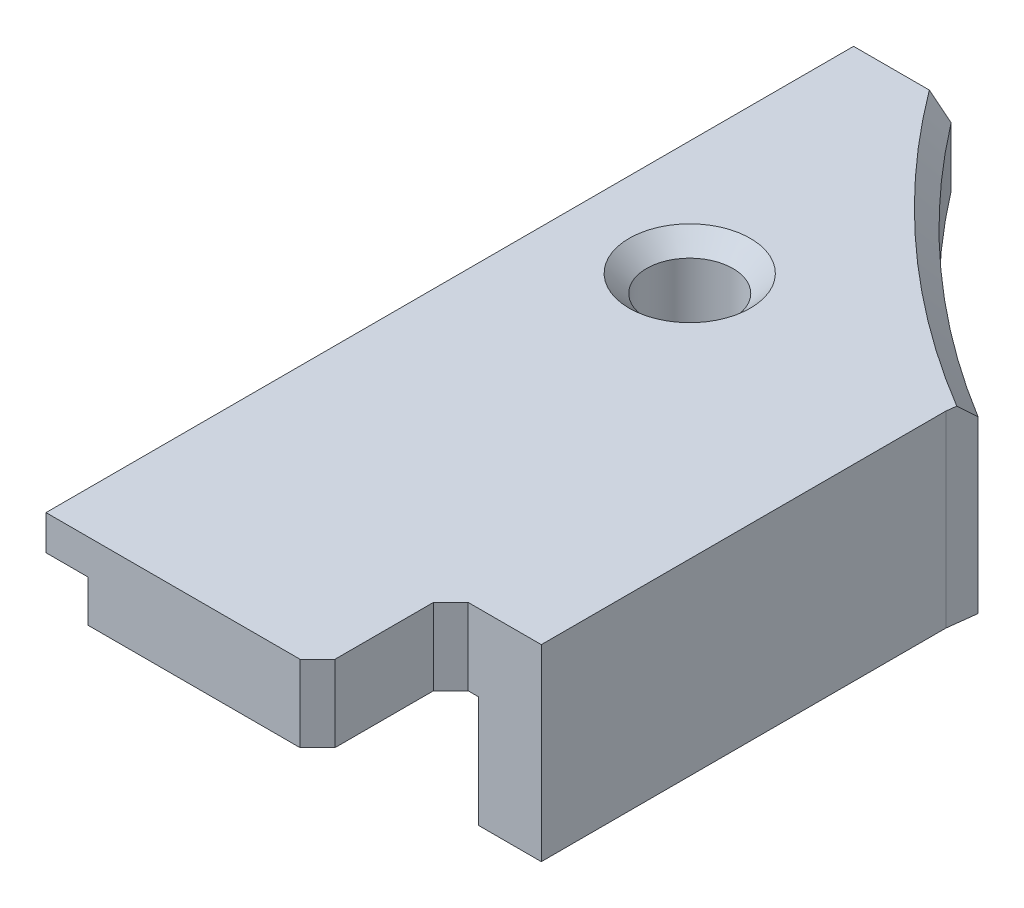
ISO-10303-21;
HEADER;
FILE_DESCRIPTION(('STEP AP214'),'2;1');
FILE_NAME('part.step','',(''),(''),'','','');
FILE_SCHEMA(('AUTOMOTIVE_DESIGN { 1 0 10303 214 1 1 1 1 }'));
ENDSEC;
DATA;
#1=APPLICATION_CONTEXT('core data for automotive mechanical design processes');
#2=APPLICATION_PROTOCOL_DEFINITION('international standard','automotive_design',2000,#1);
#3=PRODUCT_CONTEXT('',#1,'mechanical');
#4=PRODUCT('Part','Part','',(#3));
#5=PRODUCT_RELATED_PRODUCT_CATEGORY('part','',(#4));
#6=PRODUCT_DEFINITION_FORMATION('','',#4);
#7=PRODUCT_DEFINITION_CONTEXT('part definition',#1,'design');
#8=PRODUCT_DEFINITION('design','',#6,#7);
#9=PRODUCT_DEFINITION_SHAPE('','',#8);
#10=(LENGTH_UNIT() NAMED_UNIT(*) SI_UNIT(.MILLI.,.METRE.));
#11=(NAMED_UNIT(*) PLANE_ANGLE_UNIT() SI_UNIT($,.RADIAN.));
#12=(NAMED_UNIT(*) SI_UNIT($,.STERADIAN.) SOLID_ANGLE_UNIT());
#13=UNCERTAINTY_MEASURE_WITH_UNIT(LENGTH_MEASURE(1.E-05),#10,'distance_accuracy_value','');
#14=(GEOMETRIC_REPRESENTATION_CONTEXT(3) GLOBAL_UNCERTAINTY_ASSIGNED_CONTEXT((#13)) GLOBAL_UNIT_ASSIGNED_CONTEXT((#10,
#11,#12)) REPRESENTATION_CONTEXT('',''));
#15=CARTESIAN_POINT('',(0.,0.,0.));
#16=DIRECTION('',(0.,0.,1.));
#17=DIRECTION('',(1.,0.,0.));
#18=AXIS2_PLACEMENT_3D('',#15,#16,#17);
#19=CARTESIAN_POINT('',(0.,2.75,-10.0000000000344));
#20=DIRECTION('',(0.,0.,-1.));
#21=DIRECTION('',(-1.,0.,0.));
#22=AXIS2_PLACEMENT_3D('',#19,#20,#21);
#23=PLANE('',#22);
#24=DIRECTION('',(1.,0.,0.));
#25=VECTOR('',#24,1.);
#26=CARTESIAN_POINT('',(0.,2.75,-10.0000000000344));
#27=LINE('',#26,#25);
#28=CARTESIAN_POINT('',(12.75,2.75,-10.0000000000344));
#29=VERTEX_POINT('',#28);
#30=CARTESIAN_POINT('',(15.4702502927167,2.75,-10.0000000000345));
#31=VERTEX_POINT('',#30);
#32=EDGE_CURVE('E223',#29,#31,#27,.T.);
#33=ORIENTED_EDGE('',*,*,#32,.T.);
#34=CARTESIAN_POINT('',(15.4702502927167,2.75,-10.0000000000345));
#35=CARTESIAN_POINT('',(15.6004506924275,2.64551430933837,-10.0000000000345));
#36=CARTESIAN_POINT('',(15.7307784608611,2.54118813135918,-10.0000000000345));
#37=CARTESIAN_POINT('',(15.9916887386157,2.33285479801743,-10.0000000000345));
#38=CARTESIAN_POINT('',(16.1222712479435,2.22884764266329,-10.0000000000345));
#39=CARTESIAN_POINT('',(16.2529811260008,2.12500000000001,-10.0000000000345));
#40=B_SPLINE_CURVE_WITH_KNOTS('',3,(#34,#35,#36,#37,#38,#39),.UNSPECIFIED.,.F.,.F.,(4,2,4),(0.,
0.500822830679334,1.00164567457202),.UNSPECIFIED.);
#41=CARTESIAN_POINT('',(16.2529811260008,2.12500000000001,-10.0000000000345));
#42=VERTEX_POINT('',#41);
#43=EDGE_CURVE('E277',#31,#42,#40,.T.);
#44=ORIENTED_EDGE('',*,*,#43,.T.);
#45=DIRECTION('',(0.,-1.,0.));
#46=VECTOR('',#45,1.);
#47=CARTESIAN_POINT('',(16.2529811260008,2.75,-10.0000000000345));
#48=LINE('',#47,#46);
#49=CARTESIAN_POINT('',(16.2529811260008,0.,-10.0000000000345));
#50=VERTEX_POINT('',#49);
#51=EDGE_CURVE('E230',#42,#50,#48,.T.);
#52=ORIENTED_EDGE('',*,*,#51,.T.);
#53=DIRECTION('',(1.,0.,0.));
#54=VECTOR('',#53,1.);
#55=CARTESIAN_POINT('',(0.,0.,-10.0000000000344));
#56=LINE('',#55,#54);
#57=CARTESIAN_POINT('',(14.25,0.,-10.0000000000344));
#58=VERTEX_POINT('',#57);
#59=EDGE_CURVE('E232',#58,#50,#56,.T.);
#60=ORIENTED_EDGE('',*,*,#59,.F.);
#61=DIRECTION('',(0.,-1.,0.));
#62=VECTOR('',#61,1.);
#63=CARTESIAN_POINT('',(14.25,1.5,-10.0000000000344));
#64=LINE('',#63,#62);
#65=CARTESIAN_POINT('',(14.25,1.5,-10.0000000000344));
#66=VERTEX_POINT('',#65);
#67=EDGE_CURVE('E594',#66,#58,#64,.T.);
#68=ORIENTED_EDGE('',*,*,#67,.F.);
#69=DIRECTION('',(-1.,0.,0.));
#70=VECTOR('',#69,1.);
#71=CARTESIAN_POINT('',(12.5,1.5,-10.0000000000344));
#72=LINE('',#71,#70);
#73=CARTESIAN_POINT('',(12.75,1.5,-10.0000000000344));
#74=VERTEX_POINT('',#73);
#75=EDGE_CURVE('E591',#66,#74,#72,.T.);
#76=ORIENTED_EDGE('',*,*,#75,.T.);
#77=DIRECTION('',(0.,-1.,0.));
#78=VECTOR('',#77,1.);
#79=CARTESIAN_POINT('',(12.75,2.75,-10.0000000000344));
#80=LINE('',#79,#78);
#81=EDGE_CURVE('E581',#29,#74,#80,.T.);
#82=ORIENTED_EDGE('',*,*,#81,.F.);
#83=EDGE_LOOP('',(#33,#44,#52,#60,#68,#76,#82));
#84=FACE_BOUND('',#83,.T.);
#85=ADVANCED_FACE('F39',(#84),#23,.T.);
#86=CARTESIAN_POINT('',(12.5,13.8207949147356,18.9998850900372));
#87=DIRECTION('',(0.,0.,-1.));
#88=DIRECTION('',(-1.,0.,0.));
#89=AXIS2_PLACEMENT_3D('',#86,#87,#88);
#90=PLANE('',#89);
#91=DIRECTION('',(1.,0.,0.));
#92=VECTOR('',#91,1.);
#93=CARTESIAN_POINT('',(12.5,0.,18.9998850900372));
#94=LINE('',#93,#92);
#95=CARTESIAN_POINT('',(14.25,0.,18.9998850900372));
#96=VERTEX_POINT('',#95);
#97=CARTESIAN_POINT('',(21.8750000022068,0.,18.9998850900372));
#98=VERTEX_POINT('',#97);
#99=EDGE_CURVE('E217',#96,#98,#94,.T.);
#100=ORIENTED_EDGE('',*,*,#99,.T.);
#101=DIRECTION('',(0.,1.,0.));
#102=VECTOR('',#101,1.);
#103=CARTESIAN_POINT('',(21.8750000022068,13.8207949147356,18.9998850900372));
#104=LINE('',#103,#102);
#105=CARTESIAN_POINT('',(21.8750000022068,2.75,18.9998850900372));
#106=VERTEX_POINT('',#105);
#107=EDGE_CURVE('E314',#98,#106,#104,.T.);
#108=ORIENTED_EDGE('',*,*,#107,.T.);
#109=DIRECTION('',(1.,0.,0.));
#110=VECTOR('',#109,1.);
#111=CARTESIAN_POINT('',(12.5,2.75,18.9998850900372));
#112=LINE('',#111,#110);
#113=CARTESIAN_POINT('',(12.75,2.75,18.9998850900372));
#114=VERTEX_POINT('',#113);
#115=EDGE_CURVE('E219',#114,#106,#112,.T.);
#116=ORIENTED_EDGE('',*,*,#115,.F.);
#117=DIRECTION('',(0.,-1.,0.));
#118=VECTOR('',#117,1.);
#119=CARTESIAN_POINT('',(12.75,2.75,18.9998850900372));
#120=LINE('',#119,#118);
#121=CARTESIAN_POINT('',(12.75,1.5,18.9998850900372));
#122=VERTEX_POINT('',#121);
#123=EDGE_CURVE('E583',#114,#122,#120,.T.);
#124=ORIENTED_EDGE('',*,*,#123,.T.);
#125=DIRECTION('',(1.,0.,0.));
#126=VECTOR('',#125,1.);
#127=CARTESIAN_POINT('',(14.25,1.5,18.9998850900372));
#128=LINE('',#127,#126);
#129=CARTESIAN_POINT('',(14.25,1.5,18.9998850900372));
#130=VERTEX_POINT('',#129);
#131=EDGE_CURVE('E587',#122,#130,#128,.T.);
#132=ORIENTED_EDGE('',*,*,#131,.T.);
#133=DIRECTION('',(0.,-1.,0.));
#134=VECTOR('',#133,1.);
#135=CARTESIAN_POINT('',(14.25,1.5,18.9998850900372));
#136=LINE('',#135,#134);
#137=EDGE_CURVE('E199',#130,#96,#136,.T.);
#138=ORIENTED_EDGE('',*,*,#137,.T.);
#139=EDGE_LOOP('',(#100,#108,#116,#124,#132,#138));
#140=FACE_BOUND('',#139,.T.);
#141=ADVANCED_FACE('F290',(#140),#90,.F.);
#142=CARTESIAN_POINT('',(0.,2.75,0.));
#143=DIRECTION('',(0.,1.,0.));
#144=DIRECTION('',(0.,0.,1.));
#145=AXIS2_PLACEMENT_3D('',#142,#143,#144);
#146=PLANE('',#145);
#147=CARTESIAN_POINT('',(16.865979255,2.75,0.));
#148=DIRECTION('',(0.,1.,0.));
#149=DIRECTION('',(0.,0.,1.));
#150=AXIS2_PLACEMENT_3D('',#147,#148,#149);
#151=CIRCLE('',#150,2.175);
#152=CARTESIAN_POINT('',(16.865979255,2.75,2.175));
#153=VERTEX_POINT('',#152);
#154=EDGE_CURVE('E255',#153,#153,#151,.F.);
#155=ORIENTED_EDGE('',*,*,#154,.T.);
#156=EDGE_LOOP('',(#155));
#157=FACE_BOUND('',#156,.T.);
#158=DIRECTION('',(-0.120802758434646,0.,0.992676530172131));
#159=VECTOR('',#158,1.);
#160=CARTESIAN_POINT('',(25.3367503556194,2.75,3.08333000700447));
#161=LINE('',#160,#159);
#162=CARTESIAN_POINT('',(25.7925504966188,2.75,-0.662131671870063));
#163=VERTEX_POINT('',#162);
#164=CARTESIAN_POINT('',(25.7500000022048,2.75,-0.312480076994556));
#165=VERTEX_POINT('',#164);
#166=EDGE_CURVE('E206',#163,#165,#161,.T.);
#167=ORIENTED_EDGE('',*,*,#166,.F.);
#168=CARTESIAN_POINT('',(44.1426755627633,2.75,-31.3209847267169));
#169=DIRECTION('',(0.,1.,0.));
#170=DIRECTION('',(0.,0.,1.));
#171=AXIS2_PLACEMENT_3D('',#168,#169,#170);
#172=CIRCLE('',#171,35.7308320723411);
#173=EDGE_CURVE('E285',#163,#31,#172,.F.);
#174=ORIENTED_EDGE('',*,*,#173,.T.);
#175=ORIENTED_EDGE('',*,*,#32,.F.);
#176=DIRECTION('',(0.,0.,-1.));
#177=VECTOR('',#176,1.);
#178=CARTESIAN_POINT('',(12.75,2.75,-10.0000000000344));
#179=LINE('',#178,#177);
#180=EDGE_CURVE('E182',#114,#29,#179,.T.);
#181=ORIENTED_EDGE('',*,*,#180,.F.);
#182=ORIENTED_EDGE('',*,*,#115,.T.);
#183=DIRECTION('',(-0.707106781186551,0.,0.707106781186544));
#184=VECTOR('',#183,1.);
#185=CARTESIAN_POINT('',(20.4374425461219,2.75,20.4374425461221));
#186=LINE('',#185,#184);
#187=CARTESIAN_POINT('',(22.5000000022068,2.75,18.3748850900372));
#188=VERTEX_POINT('',#187);
#189=EDGE_CURVE('E322',#106,#188,#186,.F.);
#190=ORIENTED_EDGE('',*,*,#189,.T.);
#191=DIRECTION('',(0.,0.,-1.));
#192=VECTOR('',#191,1.);
#193=CARTESIAN_POINT('',(22.5000000022068,2.75,0.));
#194=LINE('',#193,#192);
#195=CARTESIAN_POINT('',(22.5000000022068,2.75,14.8386291741262));
#196=VERTEX_POINT('',#195);
#197=EDGE_CURVE('E226',#188,#196,#194,.T.);
#198=ORIENTED_EDGE('',*,*,#197,.T.);
#199=DIRECTION('',(-0.707106781186551,0.,0.707106781186544));
#200=VECTOR('',#199,1.);
#201=CARTESIAN_POINT('',(23.1250000022068,2.75,14.2136291741262));
#202=LINE('',#201,#200);
#203=CARTESIAN_POINT('',(23.1250000022068,2.75,14.2136291741262));
#204=VERTEX_POINT('',#203);
#205=EDGE_CURVE('E11',#196,#204,#202,.F.);
#206=ORIENTED_EDGE('',*,*,#205,.T.);
#207=DIRECTION('',(1.,0.,0.));
#208=VECTOR('',#207,1.);
#209=CARTESIAN_POINT('',(0.,2.75,14.2136291741262));
#210=LINE('',#209,#208);
#211=CARTESIAN_POINT('',(25.7500000022048,2.75,14.2136291741262));
#212=VERTEX_POINT('',#211);
#213=EDGE_CURVE('E193',#204,#212,#210,.T.);
#214=ORIENTED_EDGE('',*,*,#213,.T.);
#215=DIRECTION('',(0.,0.,-1.));
#216=VECTOR('',#215,1.);
#217=CARTESIAN_POINT('',(25.7500000022048,2.75,0.));
#218=LINE('',#217,#216);
#219=EDGE_CURVE('E209',#212,#165,#218,.T.);
#220=ORIENTED_EDGE('',*,*,#219,.T.);
#221=EDGE_LOOP('',(#167,#174,#175,#181,#182,#190,#198,#206,#214,#220));
#222=FACE_BOUND('',#221,.T.);
#223=ADVANCED_FACE('F304',(#157,#222),#146,.T.);
#224=CARTESIAN_POINT('',(0.,1.5,0.));
#225=DIRECTION('',(0.,-1.,0.));
#226=DIRECTION('',(0.,0.,-1.));
#227=AXIS2_PLACEMENT_3D('',#224,#225,#226);
#228=PLANE('',#227);
#229=ORIENTED_EDGE('',*,*,#131,.F.);
#230=DIRECTION('',(0.,0.,-1.));
#231=VECTOR('',#230,1.);
#232=CARTESIAN_POINT('',(12.75,1.5,0.));
#233=LINE('',#232,#231);
#234=EDGE_CURVE('E241',#122,#74,#233,.T.);
#235=ORIENTED_EDGE('',*,*,#234,.T.);
#236=ORIENTED_EDGE('',*,*,#75,.F.);
#237=DIRECTION('',(0.,0.,-1.));
#238=VECTOR('',#237,1.);
#239=CARTESIAN_POINT('',(14.25,1.5,-10.0000000000344));
#240=LINE('',#239,#238);
#241=EDGE_CURVE('E589',#130,#66,#240,.T.);
#242=ORIENTED_EDGE('',*,*,#241,.F.);
#243=EDGE_LOOP('',(#229,#235,#236,#242));
#244=FACE_BOUND('',#243,.T.);
#245=ADVANCED_FACE('F303',(#244),#228,.T.);
#246=CARTESIAN_POINT('',(0.,0.,0.));
#247=DIRECTION('',(0.,1.,0.));
#248=DIRECTION('',(0.,0.,1.));
#249=AXIS2_PLACEMENT_3D('',#246,#247,#248);
#250=PLANE('',#249);
#251=DIRECTION('',(-1.,0.,0.));
#252=VECTOR('',#251,1.);
#253=CARTESIAN_POINT('',(0.,0.,7.51362917405731));
#254=LINE('',#253,#252);
#255=CARTESIAN_POINT('',(24.7500000022057,0.,7.51362917405731));
#256=VERTEX_POINT('',#255);
#257=CARTESIAN_POINT('',(23.5000000022068,0.,7.51362917405731));
#258=VERTEX_POINT('',#257);
#259=EDGE_CURVE('E183',#256,#258,#254,.T.);
#260=ORIENTED_EDGE('',*,*,#259,.T.);
#261=DIRECTION('',(0.,0.,1.));
#262=VECTOR('',#261,1.);
#263=CARTESIAN_POINT('',(23.5000000022068,0.,0.));
#264=LINE('',#263,#262);
#265=CARTESIAN_POINT('',(23.5000000022068,0.,14.2136291741262));
#266=VERTEX_POINT('',#265);
#267=EDGE_CURVE('E181',#258,#266,#264,.T.);
#268=ORIENTED_EDGE('',*,*,#267,.T.);
#269=DIRECTION('',(1.,0.,0.));
#270=VECTOR('',#269,1.);
#271=CARTESIAN_POINT('',(0.,0.,14.2136291741262));
#272=LINE('',#271,#270);
#273=CARTESIAN_POINT('',(23.1250000022068,0.,14.2136291741262));
#274=VERTEX_POINT('',#273);
#275=EDGE_CURVE('E201',#274,#266,#272,.T.);
#276=ORIENTED_EDGE('',*,*,#275,.F.);
#277=DIRECTION('',(0.707106781186551,0.,-0.707106781186544));
#278=VECTOR('',#277,1.);
#279=CARTESIAN_POINT('',(18.6693145881664,0.,18.6693145881666));
#280=LINE('',#279,#278);
#281=CARTESIAN_POINT('',(22.5000000022068,0.,14.8386291741262));
#282=VERTEX_POINT('',#281);
#283=EDGE_CURVE('E48',#274,#282,#280,.F.);
#284=ORIENTED_EDGE('',*,*,#283,.T.);
#285=DIRECTION('',(0.,0.,-1.));
#286=VECTOR('',#285,1.);
#287=CARTESIAN_POINT('',(22.5000000022068,0.,0.));
#288=LINE('',#287,#286);
#289=CARTESIAN_POINT('',(22.5000000022068,0.,18.3748850900372));
#290=VERTEX_POINT('',#289);
#291=EDGE_CURVE('E235',#290,#282,#288,.T.);
#292=ORIENTED_EDGE('',*,*,#291,.F.);
#293=DIRECTION('',(0.707106781186551,0.,-0.707106781186544));
#294=VECTOR('',#293,1.);
#295=CARTESIAN_POINT('',(22.5000000022068,0.,18.3748850900372));
#296=LINE('',#295,#294);
#297=EDGE_CURVE('E63',#290,#98,#296,.F.);
#298=ORIENTED_EDGE('',*,*,#297,.T.);
#299=ORIENTED_EDGE('',*,*,#99,.F.);
#300=DIRECTION('',(0.,0.,-1.));
#301=VECTOR('',#300,1.);
#302=CARTESIAN_POINT('',(14.25,0.,-10.0000000000344));
#303=LINE('',#302,#301);
#304=EDGE_CURVE('E586',#96,#58,#303,.T.);
#305=ORIENTED_EDGE('',*,*,#304,.T.);
#306=ORIENTED_EDGE('',*,*,#59,.T.);
#307=CARTESIAN_POINT('',(44.1426755627633,0.,-31.3209847267169));
#308=DIRECTION('',(0.,1.,0.));
#309=DIRECTION('',(0.,0.,1.));
#310=AXIS2_PLACEMENT_3D('',#307,#308,#309);
#311=CIRCLE('',#310,35.1058320723411);
#312=CARTESIAN_POINT('',(24.9466325339046,0.,-1.92827512849145));
#313=VERTEX_POINT('',#312);
#314=EDGE_CURVE('E222',#50,#313,#311,.T.);
#315=ORIENTED_EDGE('',*,*,#314,.T.);
#316=DIRECTION('',(-0.12080275843464,0.,0.992676530172131));
#317=VECTOR('',#316,1.);
#318=CARTESIAN_POINT('',(24.3513436620657,0.,2.96341194392631));
#319=LINE('',#318,#317);
#320=CARTESIAN_POINT('',(24.7500000022057,0.,-0.312480076994557));
#321=VERTEX_POINT('',#320);
#322=EDGE_CURVE('E566',#313,#321,#319,.T.);
#323=ORIENTED_EDGE('',*,*,#322,.T.);
#324=DIRECTION('',(0.,0.,1.));
#325=VECTOR('',#324,1.);
#326=CARTESIAN_POINT('',(24.7500000022057,0.,0.));
#327=LINE('',#326,#325);
#328=EDGE_CURVE('E563',#321,#256,#327,.T.);
#329=ORIENTED_EDGE('',*,*,#328,.T.);
#330=EDGE_LOOP('',(#260,#268,#276,#284,#292,#298,#299,#305,#306,#315,#323,#329));
#331=FACE_BOUND('',#330,.T.);
#332=CARTESIAN_POINT('',(16.865979255,0.,0.));
#333=DIRECTION('',(0.,1.,0.));
#334=DIRECTION('',(0.,0.,1.));
#335=AXIS2_PLACEMENT_3D('',#332,#333,#334);
#336=CIRCLE('',#335,1.55);
#337=CARTESIAN_POINT('',(16.865979255,0.,1.55));
#338=VERTEX_POINT('',#337);
#339=EDGE_CURVE('E227',#338,#338,#336,.F.);
#340=ORIENTED_EDGE('',*,*,#339,.F.);
#341=EDGE_LOOP('',(#340));
#342=FACE_BOUND('',#341,.T.);
#343=ADVANCED_FACE('F295',(#331,#342),#250,.F.);
#344=CARTESIAN_POINT('',(22.5000000022068,2.75,0.));
#345=DIRECTION('',(-1.,0.,0.));
#346=DIRECTION('',(0.,0.,1.));
#347=AXIS2_PLACEMENT_3D('',#344,#345,#346);
#348=PLANE('',#347);
#349=ORIENTED_EDGE('',*,*,#291,.T.);
#350=DIRECTION('',(0.,1.,0.));
#351=VECTOR('',#350,1.);
#352=CARTESIAN_POINT('',(22.5000000022068,2.75,14.8386291741262));
#353=LINE('',#352,#351);
#354=EDGE_CURVE('E327',#282,#196,#353,.T.);
#355=ORIENTED_EDGE('',*,*,#354,.T.);
#356=ORIENTED_EDGE('',*,*,#197,.F.);
#357=DIRECTION('',(0.,-1.,0.));
#358=VECTOR('',#357,1.);
#359=CARTESIAN_POINT('',(22.5000000022068,2.75,18.3748850900372));
#360=LINE('',#359,#358);
#361=EDGE_CURVE('E337',#188,#290,#360,.T.);
#362=ORIENTED_EDGE('',*,*,#361,.T.);
#363=EDGE_LOOP('',(#349,#355,#356,#362));
#364=FACE_BOUND('',#363,.T.);
#365=ADVANCED_FACE('F292',(#364),#348,.F.);
#366=CARTESIAN_POINT('',(44.1426755627633,2.75,-31.3209847267169));
#367=DIRECTION('',(0.,-1.,0.));
#368=DIRECTION('',(0.,0.,-1.));
#369=AXIS2_PLACEMENT_3D('',#366,#367,#368);
#370=CYLINDRICAL_SURFACE('',#369,35.1058320723411);
#371=DIRECTION('',(0.,-1.,0.));
#372=VECTOR('',#371,1.);
#373=CARTESIAN_POINT('',(24.9466325339046,9.70281417801352,-1.92827512849146));
#374=LINE('',#373,#372);
#375=CARTESIAN_POINT('',(24.9466325339046,-4.,-1.92827512849146));
#376=VERTEX_POINT('',#375);
#377=EDGE_CURVE('E173',#313,#376,#374,.T.);
#378=ORIENTED_EDGE('',*,*,#377,.F.);
#379=ORIENTED_EDGE('',*,*,#314,.F.);
#380=ORIENTED_EDGE('',*,*,#51,.F.);
#381=CARTESIAN_POINT('',(44.1426755627633,2.12500000000001,-31.3209847267169));
#382=DIRECTION('',(0.,1.,0.));
#383=DIRECTION('',(0.,0.,1.));
#384=AXIS2_PLACEMENT_3D('',#381,#382,#383);
#385=CIRCLE('',#384,35.1058320723411);
#386=CARTESIAN_POINT('',(25.8753196118497,2.12500000000001,-1.34227307904881));
#387=VERTEX_POINT('',#386);
#388=EDGE_CURVE('E244',#42,#387,#385,.T.);
#389=ORIENTED_EDGE('',*,*,#388,.T.);
#390=DIRECTION('',(0.,-1.,0.));
#391=VECTOR('',#390,1.);
#392=CARTESIAN_POINT('',(25.8753196118497,19.3902867465702,-1.34227307904881));
#393=LINE('',#392,#391);
#394=CARTESIAN_POINT('',(25.8753196118497,-4.,-1.34227307904881));
#395=VERTEX_POINT('',#394);
#396=EDGE_CURVE('E204',#387,#395,#393,.T.);
#397=ORIENTED_EDGE('',*,*,#396,.T.);
#398=CARTESIAN_POINT('',(44.1426755627633,-4.,-31.3209847267169));
#399=DIRECTION('',(0.,1.,0.));
#400=DIRECTION('',(0.,0.,1.));
#401=AXIS2_PLACEMENT_3D('',#398,#399,#400);
#402=CIRCLE('',#401,35.1058320723411);
#403=EDGE_CURVE('E191',#376,#395,#402,.T.);
#404=ORIENTED_EDGE('',*,*,#403,.F.);
#405=EDGE_LOOP('',(#378,#379,#380,#389,#397,#404));
#406=FACE_BOUND('',#405,.T.);
#407=ADVANCED_FACE('F273',(#406),#370,.F.);
#408=CARTESIAN_POINT('',(16.865979255,2.75,0.));
#409=DIRECTION('',(0.,-1.,0.));
#410=DIRECTION('',(0.,0.,-1.));
#411=AXIS2_PLACEMENT_3D('',#408,#409,#410);
#412=CYLINDRICAL_SURFACE('',#411,1.55);
#413=CARTESIAN_POINT('',(16.865979255,2.125,0.));
#414=DIRECTION('',(0.,1.,0.));
#415=DIRECTION('',(0.,0.,1.));
#416=AXIS2_PLACEMENT_3D('',#413,#414,#415);
#417=CIRCLE('',#416,1.55);
#418=CARTESIAN_POINT('',(16.865979255,2.125,1.55));
#419=VERTEX_POINT('',#418);
#420=EDGE_CURVE('E323',#419,#419,#417,.T.);
#421=ORIENTED_EDGE('',*,*,#420,.T.);
#422=EDGE_LOOP('',(#421));
#423=FACE_BOUND('',#422,.T.);
#424=ORIENTED_EDGE('',*,*,#339,.T.);
#425=EDGE_LOOP('',(#424));
#426=FACE_BOUND('',#425,.T.);
#427=ADVANCED_FACE('F297',(#423,#426),#412,.F.);
#428=CARTESIAN_POINT('',(25.3367503556194,19.3902867465702,3.08333000700447));
#429=DIRECTION('',(0.99267653017213,0.,0.120802758434646));
#430=DIRECTION('',(0.120802758434646,0.,-0.992676530172131));
#431=AXIS2_PLACEMENT_3D('',#428,#429,#430);
#432=PLANE('',#431);
#433=ORIENTED_EDGE('',*,*,#396,.F.);
#434=CARTESIAN_POINT('',(25.8753196118497,2.12500000000001,-1.3422730790488));
#435=CARTESIAN_POINT('',(25.8615136052509,2.22906544677306,-1.22882452122098));
#436=CARTESIAN_POINT('',(25.8477131756703,2.33318150358327,-1.11542179161069));
#437=CARTESIAN_POINT('',(25.8201234705934,2.54151483691695,-0.888707989218097));
#438=CARTESIAN_POINT('',(25.806334195097,2.64573211344007,-0.775396916435471));
#439=CARTESIAN_POINT('',(25.7925504966188,2.75,-0.66213167187006));
#440=B_SPLINE_CURVE_WITH_KNOTS('',3,(#434,#435,#436,#437,#438,#439),.UNSPECIFIED.,.F.,.F.,(4,2,
4),(0.,0.463699318555046,0.927398635502837),.UNSPECIFIED.);
#441=EDGE_CURVE('E247',#387,#163,#440,.T.);
#442=ORIENTED_EDGE('',*,*,#441,.T.);
#443=ORIENTED_EDGE('',*,*,#166,.T.);
#444=DIRECTION('',(0.,-1.,0.));
#445=VECTOR('',#444,1.);
#446=CARTESIAN_POINT('',(25.7500000022048,19.3902867465702,-0.312480076994556));
#447=LINE('',#446,#445);
#448=CARTESIAN_POINT('',(25.7500000022048,-4.,-0.312480076994556));
#449=VERTEX_POINT('',#448);
#450=EDGE_CURVE('E208',#165,#449,#447,.T.);
#451=ORIENTED_EDGE('',*,*,#450,.T.);
#452=DIRECTION('',(-0.120802758434646,0.,0.992676530172131));
#453=VECTOR('',#452,1.);
#454=CARTESIAN_POINT('',(25.3367503556194,-4.,3.08333000700447));
#455=LINE('',#454,#453);
#456=EDGE_CURVE('E195',#395,#449,#455,.T.);
#457=ORIENTED_EDGE('',*,*,#456,.F.);
#458=EDGE_LOOP('',(#433,#442,#443,#451,#457));
#459=FACE_BOUND('',#458,.T.);
#460=ADVANCED_FACE('F257',(#459),#432,.T.);
#461=CARTESIAN_POINT('',(25.7500000022048,19.3902867465702,0.));
#462=DIRECTION('',(-1.,0.,0.));
#463=DIRECTION('',(0.,0.,1.));
#464=AXIS2_PLACEMENT_3D('',#461,#462,#463);
#465=PLANE('',#464);
#466=ORIENTED_EDGE('',*,*,#219,.F.);
#467=DIRECTION('',(0.,-1.,0.));
#468=VECTOR('',#467,1.);
#469=CARTESIAN_POINT('',(25.7500000022048,19.3902867465702,14.2136291741262));
#470=LINE('',#469,#468);
#471=CARTESIAN_POINT('',(25.7500000022048,-4.,14.2136291741262));
#472=VERTEX_POINT('',#471);
#473=EDGE_CURVE('E205',#212,#472,#470,.T.);
#474=ORIENTED_EDGE('',*,*,#473,.T.);
#475=DIRECTION('',(0.,0.,-1.));
#476=VECTOR('',#475,1.);
#477=CARTESIAN_POINT('',(25.7500000022048,-4.,0.));
#478=LINE('',#477,#476);
#479=EDGE_CURVE('E599',#472,#449,#478,.T.);
#480=ORIENTED_EDGE('',*,*,#479,.T.);
#481=ORIENTED_EDGE('',*,*,#450,.F.);
#482=EDGE_LOOP('',(#466,#474,#480,#481));
#483=FACE_BOUND('',#482,.T.);
#484=ADVANCED_FACE('F424',(#483),#465,.F.);
#485=CARTESIAN_POINT('',(0.,19.3902867465702,14.2136291741262));
#486=DIRECTION('',(0.,0.,-1.));
#487=DIRECTION('',(-1.,0.,0.));
#488=AXIS2_PLACEMENT_3D('',#485,#486,#487);
#489=PLANE('',#488);
#490=ORIENTED_EDGE('',*,*,#213,.F.);
#491=DIRECTION('',(0.,-1.,0.));
#492=VECTOR('',#491,1.);
#493=CARTESIAN_POINT('',(23.1250000022068,0.,14.2136291741262));
#494=LINE('',#493,#492);
#495=EDGE_CURVE('E284',#204,#274,#494,.T.);
#496=ORIENTED_EDGE('',*,*,#495,.T.);
#497=ORIENTED_EDGE('',*,*,#275,.T.);
#498=DIRECTION('',(0.,1.,0.));
#499=VECTOR('',#498,1.);
#500=CARTESIAN_POINT('',(23.5000000022068,-4.,14.2136291741262));
#501=LINE('',#500,#499);
#502=CARTESIAN_POINT('',(23.5000000022068,-4.,14.2136291741262));
#503=VERTEX_POINT('',#502);
#504=EDGE_CURVE('E190',#503,#266,#501,.T.);
#505=ORIENTED_EDGE('',*,*,#504,.F.);
#506=DIRECTION('',(1.,0.,0.));
#507=VECTOR('',#506,1.);
#508=CARTESIAN_POINT('',(0.,-4.,14.2136291741262));
#509=LINE('',#508,#507);
#510=EDGE_CURVE('E189',#503,#472,#509,.T.);
#511=ORIENTED_EDGE('',*,*,#510,.T.);
#512=ORIENTED_EDGE('',*,*,#473,.F.);
#513=EDGE_LOOP('',(#490,#496,#497,#505,#511,#512));
#514=FACE_BOUND('',#513,.T.);
#515=ADVANCED_FACE('F341',(#514),#489,.F.);
#516=CARTESIAN_POINT('',(23.5000000022068,-4.,0.));
#517=DIRECTION('',(-1.,0.,0.));
#518=DIRECTION('',(0.,0.,1.));
#519=AXIS2_PLACEMENT_3D('',#516,#517,#518);
#520=PLANE('',#519);
#521=DIRECTION('',(0.,-1.,0.));
#522=VECTOR('',#521,1.);
#523=CARTESIAN_POINT('',(23.5000000022068,9.70281417801352,7.51362917405731));
#524=LINE('',#523,#522);
#525=CARTESIAN_POINT('',(23.5000000022068,-4.,7.51362917405731));
#526=VERTEX_POINT('',#525);
#527=EDGE_CURVE('E168',#258,#526,#524,.T.);
#528=ORIENTED_EDGE('',*,*,#527,.T.);
#529=DIRECTION('',(0.,0.,1.));
#530=VECTOR('',#529,1.);
#531=CARTESIAN_POINT('',(23.5000000022068,-4.,0.));
#532=LINE('',#531,#530);
#533=EDGE_CURVE('E179',#526,#503,#532,.T.);
#534=ORIENTED_EDGE('',*,*,#533,.T.);
#535=ORIENTED_EDGE('',*,*,#504,.T.);
#536=ORIENTED_EDGE('',*,*,#267,.F.);
#537=EDGE_LOOP('',(#528,#534,#535,#536));
#538=FACE_BOUND('',#537,.T.);
#539=ADVANCED_FACE('F177',(#538),#520,.T.);
#540=CARTESIAN_POINT('',(0.,-4.,0.));
#541=DIRECTION('',(0.,1.,0.));
#542=DIRECTION('',(0.,0.,1.));
#543=AXIS2_PLACEMENT_3D('',#540,#541,#542);
#544=PLANE('',#543);
#545=DIRECTION('',(0.,0.,1.));
#546=VECTOR('',#545,1.);
#547=CARTESIAN_POINT('',(24.7500000022057,-4.,0.));
#548=LINE('',#547,#546);
#549=CARTESIAN_POINT('',(24.7500000022057,-4.,-0.312480076994557));
#550=VERTEX_POINT('',#549);
#551=CARTESIAN_POINT('',(24.7500000022057,-4.,7.51362917405731));
#552=VERTEX_POINT('',#551);
#553=EDGE_CURVE('E55',#550,#552,#548,.T.);
#554=ORIENTED_EDGE('',*,*,#553,.F.);
#555=DIRECTION('',(-0.12080275843464,0.,0.992676530172131));
#556=VECTOR('',#555,1.);
#557=CARTESIAN_POINT('',(24.3513436620657,-4.,2.96341194392631));
#558=LINE('',#557,#556);
#559=EDGE_CURVE('E569',#376,#550,#558,.T.);
#560=ORIENTED_EDGE('',*,*,#559,.F.);
#561=ORIENTED_EDGE('',*,*,#403,.T.);
#562=ORIENTED_EDGE('',*,*,#456,.T.);
#563=ORIENTED_EDGE('',*,*,#479,.F.);
#564=ORIENTED_EDGE('',*,*,#510,.F.);
#565=ORIENTED_EDGE('',*,*,#533,.F.);
#566=DIRECTION('',(-1.,0.,0.));
#567=VECTOR('',#566,1.);
#568=CARTESIAN_POINT('',(0.,-4.,7.51362917405731));
#569=LINE('',#568,#567);
#570=EDGE_CURVE('E165',#552,#526,#569,.T.);
#571=ORIENTED_EDGE('',*,*,#570,.F.);
#572=EDGE_LOOP('',(#554,#560,#561,#562,#563,#564,#565,#571));
#573=FACE_BOUND('',#572,.T.);
#574=ADVANCED_FACE('F186',(#573),#544,.F.);
#575=CARTESIAN_POINT('',(14.25,1.5,-10.0000000000344));
#576=DIRECTION('',(-1.,0.,0.));
#577=DIRECTION('',(0.,0.,1.));
#578=AXIS2_PLACEMENT_3D('',#575,#576,#577);
#579=PLANE('',#578);
#580=ORIENTED_EDGE('',*,*,#304,.F.);
#581=ORIENTED_EDGE('',*,*,#137,.F.);
#582=ORIENTED_EDGE('',*,*,#241,.T.);
#583=ORIENTED_EDGE('',*,*,#67,.T.);
#584=EDGE_LOOP('',(#580,#581,#582,#583));
#585=FACE_BOUND('',#584,.T.);
#586=ADVANCED_FACE('F387',(#585),#579,.T.);
#587=CARTESIAN_POINT('',(12.75,2.75,-10.0000000000344));
#588=DIRECTION('',(-1.,0.,0.));
#589=DIRECTION('',(0.,0.,1.));
#590=AXIS2_PLACEMENT_3D('',#587,#588,#589);
#591=PLANE('',#590);
#592=ORIENTED_EDGE('',*,*,#123,.F.);
#593=ORIENTED_EDGE('',*,*,#180,.T.);
#594=ORIENTED_EDGE('',*,*,#81,.T.);
#595=ORIENTED_EDGE('',*,*,#234,.F.);
#596=EDGE_LOOP('',(#592,#593,#594,#595));
#597=FACE_BOUND('',#596,.T.);
#598=ADVANCED_FACE('F271',(#597),#591,.T.);
#599=CARTESIAN_POINT('',(44.1426755627633,2.12500000000001,-31.3209847267169));
#600=DIRECTION('',(0.,1.,0.));
#601=DIRECTION('',(0.,0.,1.));
#602=AXIS2_PLACEMENT_3D('',#599,#600,#601);
#603=CONICAL_SURFACE('',#602,35.1058320723411,0.785398163397451);
#604=ORIENTED_EDGE('',*,*,#43,.F.);
#605=ORIENTED_EDGE('',*,*,#173,.F.);
#606=ORIENTED_EDGE('',*,*,#441,.F.);
#607=ORIENTED_EDGE('',*,*,#388,.F.);
#608=EDGE_LOOP('',(#604,#605,#606,#607));
#609=FACE_BOUND('',#608,.T.);
#610=ADVANCED_FACE('F262',(#609),#603,.F.);
#611=CARTESIAN_POINT('',(23.1250000022068,19.3902867465702,14.2136291741262));
#612=DIRECTION('',(0.707106781186543,0.,0.707106781186551));
#613=DIRECTION('',(0.,1.,0.));
#614=AXIS2_PLACEMENT_3D('',#611,#612,#613);
#615=PLANE('',#614);
#616=ORIENTED_EDGE('',*,*,#205,.F.);
#617=ORIENTED_EDGE('',*,*,#354,.F.);
#618=ORIENTED_EDGE('',*,*,#283,.F.);
#619=ORIENTED_EDGE('',*,*,#495,.F.);
#620=EDGE_LOOP('',(#616,#617,#618,#619));
#621=FACE_BOUND('',#620,.T.);
#622=ADVANCED_FACE('F270',(#621),#615,.T.);
#623=CARTESIAN_POINT('',(22.5000000022068,2.75,18.3748850900372));
#624=DIRECTION('',(-0.707106781186544,0.,-0.707106781186551));
#625=DIRECTION('',(0.,-1.,0.));
#626=AXIS2_PLACEMENT_3D('',#623,#624,#625);
#627=PLANE('',#626);
#628=ORIENTED_EDGE('',*,*,#189,.F.);
#629=ORIENTED_EDGE('',*,*,#107,.F.);
#630=ORIENTED_EDGE('',*,*,#297,.F.);
#631=ORIENTED_EDGE('',*,*,#361,.F.);
#632=EDGE_LOOP('',(#628,#629,#630,#631));
#633=FACE_BOUND('',#632,.T.);
#634=ADVANCED_FACE('F319',(#633),#627,.F.);
#635=CARTESIAN_POINT('',(16.865979255,2.75,0.));
#636=DIRECTION('',(0.,1.,0.));
#637=DIRECTION('',(0.,0.,1.));
#638=AXIS2_PLACEMENT_3D('',#635,#636,#637);
#639=CONICAL_SURFACE('',#638,2.175,0.785398163397447);
#640=ORIENTED_EDGE('',*,*,#420,.F.);
#641=EDGE_LOOP('',(#640));
#642=FACE_BOUND('',#641,.T.);
#643=ORIENTED_EDGE('',*,*,#154,.F.);
#644=EDGE_LOOP('',(#643));
#645=FACE_BOUND('',#644,.T.);
#646=ADVANCED_FACE('F42',(#642,#645),#639,.F.);
#647=CARTESIAN_POINT('',(24.3513436620657,9.70281417801352,2.96341194392631));
#648=DIRECTION('',(0.992676530172131,0.,0.12080275843464));
#649=DIRECTION('',(0.12080275843464,0.,-0.992676530172131));
#650=AXIS2_PLACEMENT_3D('',#647,#648,#649);
#651=PLANE('',#650);
#652=ORIENTED_EDGE('',*,*,#377,.T.);
#653=ORIENTED_EDGE('',*,*,#559,.T.);
#654=DIRECTION('',(0.,-1.,0.));
#655=VECTOR('',#654,1.);
#656=CARTESIAN_POINT('',(24.7500000022057,9.70281417801352,-0.312480076994557));
#657=LINE('',#656,#655);
#658=EDGE_CURVE('E560',#321,#550,#657,.T.);
#659=ORIENTED_EDGE('',*,*,#658,.F.);
#660=ORIENTED_EDGE('',*,*,#322,.F.);
#661=EDGE_LOOP('',(#652,#653,#659,#660));
#662=FACE_BOUND('',#661,.T.);
#663=ADVANCED_FACE('F352',(#662),#651,.F.);
#664=CARTESIAN_POINT('',(24.7500000022057,9.70281417801352,0.));
#665=DIRECTION('',(1.,0.,0.));
#666=DIRECTION('',(0.,0.,-1.));
#667=AXIS2_PLACEMENT_3D('',#664,#665,#666);
#668=PLANE('',#667);
#669=ORIENTED_EDGE('',*,*,#658,.T.);
#670=ORIENTED_EDGE('',*,*,#553,.T.);
#671=DIRECTION('',(0.,-1.,0.));
#672=VECTOR('',#671,1.);
#673=CARTESIAN_POINT('',(24.7500000022057,9.70281417801352,7.51362917405731));
#674=LINE('',#673,#672);
#675=EDGE_CURVE('E170',#256,#552,#674,.T.);
#676=ORIENTED_EDGE('',*,*,#675,.F.);
#677=ORIENTED_EDGE('',*,*,#328,.F.);
#678=EDGE_LOOP('',(#669,#670,#676,#677));
#679=FACE_BOUND('',#678,.T.);
#680=ADVANCED_FACE('F358',(#679),#668,.F.);
#681=CARTESIAN_POINT('',(0.,9.70281417801352,7.51362917405731));
#682=DIRECTION('',(0.,0.,1.));
#683=DIRECTION('',(1.,0.,0.));
#684=AXIS2_PLACEMENT_3D('',#681,#682,#683);
#685=PLANE('',#684);
#686=ORIENTED_EDGE('',*,*,#675,.T.);
#687=ORIENTED_EDGE('',*,*,#570,.T.);
#688=ORIENTED_EDGE('',*,*,#527,.F.);
#689=ORIENTED_EDGE('',*,*,#259,.F.);
#690=EDGE_LOOP('',(#686,#687,#688,#689));
#691=FACE_BOUND('',#690,.T.);
#692=ADVANCED_FACE('F167',(#691),#685,.F.);
#693=CLOSED_SHELL('',(#85,#141,#223,#245,#343,#365,#407,#427,#460,#484,#515,#539,#574,#586,#598,
#610,#622,#634,#646,#663,#680,#692));
#694=MANIFOLD_SOLID_BREP('B2',#693);
#695=ADVANCED_BREP_SHAPE_REPRESENTATION('',(#18,#694),#14);
#696=SHAPE_DEFINITION_REPRESENTATION(#9,#695);
ENDSEC;
END-ISO-10303-21;
